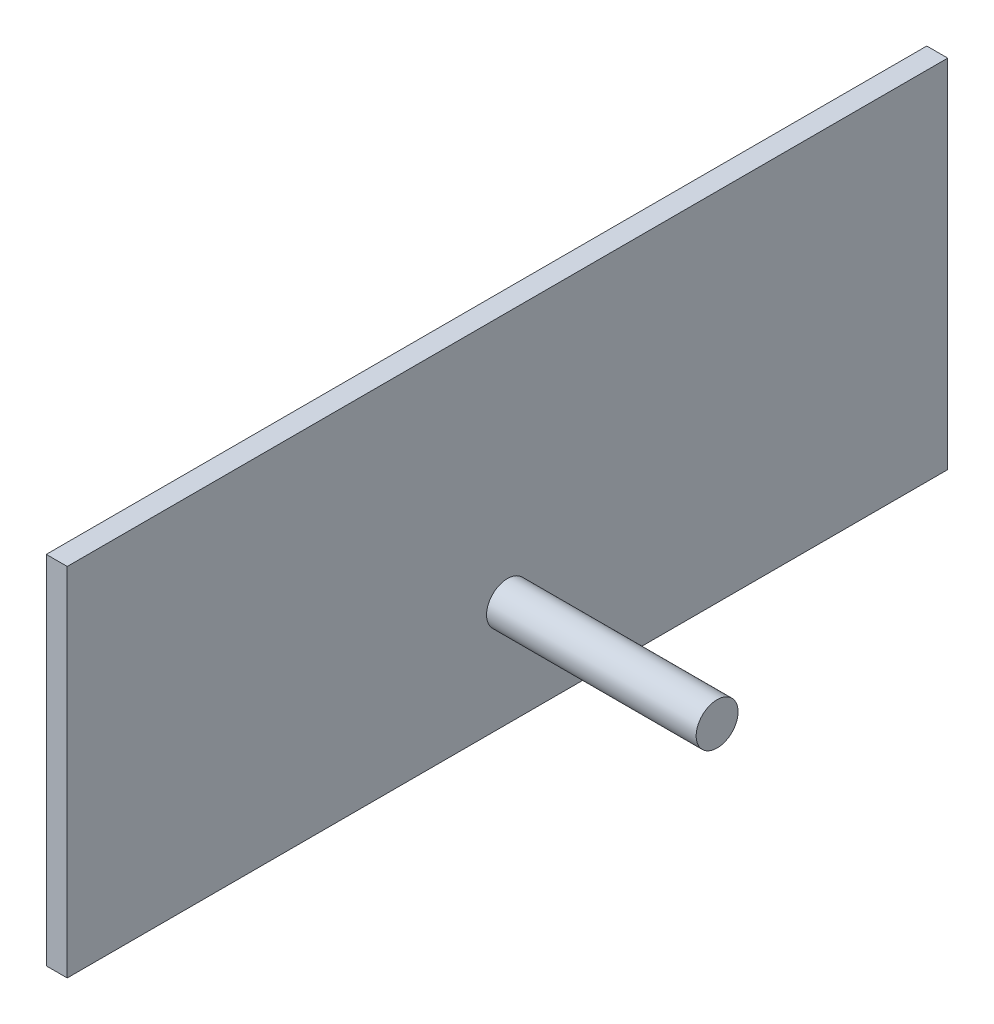
ISO-10303-21;
HEADER;
FILE_DESCRIPTION(('STEP AP214'),'2;1');
FILE_NAME('part.step','',(''),(''),'','','');
FILE_SCHEMA(('AUTOMOTIVE_DESIGN { 1 0 10303 214 1 1 1 1 }'));
ENDSEC;
DATA;
#1=APPLICATION_CONTEXT('core data for automotive mechanical design processes');
#2=APPLICATION_PROTOCOL_DEFINITION('international standard','automotive_design',2000,#1);
#3=PRODUCT_CONTEXT('',#1,'mechanical');
#4=PRODUCT('Part','Part','',(#3));
#5=PRODUCT_RELATED_PRODUCT_CATEGORY('part','',(#4));
#6=PRODUCT_DEFINITION_FORMATION('','',#4);
#7=PRODUCT_DEFINITION_CONTEXT('part definition',#1,'design');
#8=PRODUCT_DEFINITION('design','',#6,#7);
#9=PRODUCT_DEFINITION_SHAPE('','',#8);
#10=(LENGTH_UNIT() NAMED_UNIT(*) SI_UNIT(.MILLI.,.METRE.));
#11=(NAMED_UNIT(*) PLANE_ANGLE_UNIT() SI_UNIT($,.RADIAN.));
#12=(NAMED_UNIT(*) SI_UNIT($,.STERADIAN.) SOLID_ANGLE_UNIT());
#13=UNCERTAINTY_MEASURE_WITH_UNIT(LENGTH_MEASURE(1.E-05),#10,'distance_accuracy_value','');
#14=(GEOMETRIC_REPRESENTATION_CONTEXT(3) GLOBAL_UNCERTAINTY_ASSIGNED_CONTEXT((#13)) GLOBAL_UNIT_ASSIGNED_CONTEXT((#10,
#11,#12)) REPRESENTATION_CONTEXT('',''));
#15=CARTESIAN_POINT('',(0.,0.,0.));
#16=DIRECTION('',(0.,0.,1.));
#17=DIRECTION('',(1.,0.,0.));
#18=AXIS2_PLACEMENT_3D('',#15,#16,#17);
#19=CARTESIAN_POINT('',(-5.,-25.,0.));
#20=DIRECTION('',(0.,-1.,0.));
#21=DIRECTION('',(0.,0.,-1.));
#22=AXIS2_PLACEMENT_3D('',#19,#20,#21);
#23=PLANE('',#22);
#24=DIRECTION('',(0.,0.,-1.));
#25=VECTOR('',#24,1.);
#26=CARTESIAN_POINT('',(0.,-25.,0.));
#27=LINE('',#26,#25);
#28=CARTESIAN_POINT('',(0.,-25.,105.));
#29=VERTEX_POINT('',#28);
#30=CARTESIAN_POINT('',(0.,-25.,-105.));
#31=VERTEX_POINT('',#30);
#32=EDGE_CURVE('E77',#29,#31,#27,.T.);
#33=ORIENTED_EDGE('',*,*,#32,.F.);
#34=DIRECTION('',(1.,0.,0.));
#35=VECTOR('',#34,1.);
#36=CARTESIAN_POINT('',(-5.,-25.,105.));
#37=LINE('',#36,#35);
#38=CARTESIAN_POINT('',(-5.,-25.,105.));
#39=VERTEX_POINT('',#38);
#40=EDGE_CURVE('E54',#39,#29,#37,.T.);
#41=ORIENTED_EDGE('',*,*,#40,.F.);
#42=DIRECTION('',(0.,0.,-1.));
#43=VECTOR('',#42,1.);
#44=CARTESIAN_POINT('',(-5.,-25.,105.));
#45=LINE('',#44,#43);
#46=CARTESIAN_POINT('',(-5.,-25.,-105.));
#47=VERTEX_POINT('',#46);
#48=EDGE_CURVE('E62',#39,#47,#45,.T.);
#49=ORIENTED_EDGE('',*,*,#48,.T.);
#50=DIRECTION('',(1.,0.,0.));
#51=VECTOR('',#50,1.);
#52=CARTESIAN_POINT('',(-5.,-25.,-105.));
#53=LINE('',#52,#51);
#54=EDGE_CURVE('E12',#47,#31,#53,.T.);
#55=ORIENTED_EDGE('',*,*,#54,.T.);
#56=EDGE_LOOP('',(#33,#41,#49,#55));
#57=FACE_BOUND('',#56,.T.);
#58=ADVANCED_FACE('F44',(#57),#23,.T.);
#59=CARTESIAN_POINT('',(-5.,0.,105.));
#60=DIRECTION('',(0.,0.,1.));
#61=DIRECTION('',(1.,0.,0.));
#62=AXIS2_PLACEMENT_3D('',#59,#60,#61);
#63=PLANE('',#62);
#64=DIRECTION('',(0.,-1.,0.));
#65=VECTOR('',#64,1.);
#66=CARTESIAN_POINT('',(0.,0.,105.));
#67=LINE('',#66,#65);
#68=CARTESIAN_POINT('',(0.,60.,105.));
#69=VERTEX_POINT('',#68);
#70=EDGE_CURVE('E106',#69,#29,#67,.T.);
#71=ORIENTED_EDGE('',*,*,#70,.F.);
#72=DIRECTION('',(1.,0.,0.));
#73=VECTOR('',#72,1.);
#74=CARTESIAN_POINT('',(-5.,60.,105.));
#75=LINE('',#74,#73);
#76=CARTESIAN_POINT('',(-5.,60.,105.));
#77=VERTEX_POINT('',#76);
#78=EDGE_CURVE('E97',#77,#69,#75,.T.);
#79=ORIENTED_EDGE('',*,*,#78,.F.);
#80=DIRECTION('',(0.,-1.,0.));
#81=VECTOR('',#80,1.);
#82=CARTESIAN_POINT('',(-5.,0.,105.));
#83=LINE('',#82,#81);
#84=EDGE_CURVE('E101',#77,#39,#83,.T.);
#85=ORIENTED_EDGE('',*,*,#84,.T.);
#86=ORIENTED_EDGE('',*,*,#40,.T.);
#87=EDGE_LOOP('',(#71,#79,#85,#86));
#88=FACE_BOUND('',#87,.T.);
#89=ADVANCED_FACE('F104',(#88),#63,.T.);
#90=CARTESIAN_POINT('',(-5.,60.,105.));
#91=DIRECTION('',(0.,1.,0.));
#92=DIRECTION('',(0.,0.,1.));
#93=AXIS2_PLACEMENT_3D('',#90,#91,#92);
#94=PLANE('',#93);
#95=DIRECTION('',(0.,0.,1.));
#96=VECTOR('',#95,1.);
#97=CARTESIAN_POINT('',(0.,60.,105.));
#98=LINE('',#97,#96);
#99=CARTESIAN_POINT('',(0.,60.,-105.));
#100=VERTEX_POINT('',#99);
#101=EDGE_CURVE('E113',#100,#69,#98,.T.);
#102=ORIENTED_EDGE('',*,*,#101,.F.);
#103=DIRECTION('',(1.,0.,0.));
#104=VECTOR('',#103,1.);
#105=CARTESIAN_POINT('',(-5.,60.,-105.));
#106=LINE('',#105,#104);
#107=CARTESIAN_POINT('',(-5.,60.,-105.));
#108=VERTEX_POINT('',#107);
#109=EDGE_CURVE('E48',#108,#100,#106,.T.);
#110=ORIENTED_EDGE('',*,*,#109,.F.);
#111=DIRECTION('',(0.,0.,1.));
#112=VECTOR('',#111,1.);
#113=CARTESIAN_POINT('',(-5.,60.,0.));
#114=LINE('',#113,#112);
#115=EDGE_CURVE('E94',#108,#77,#114,.T.);
#116=ORIENTED_EDGE('',*,*,#115,.T.);
#117=ORIENTED_EDGE('',*,*,#78,.T.);
#118=EDGE_LOOP('',(#102,#110,#116,#117));
#119=FACE_BOUND('',#118,.T.);
#120=ADVANCED_FACE('F96',(#119),#94,.T.);
#121=CARTESIAN_POINT('',(-5.,60.,-105.));
#122=DIRECTION('',(0.,0.,-1.));
#123=DIRECTION('',(-1.,0.,0.));
#124=AXIS2_PLACEMENT_3D('',#121,#122,#123);
#125=PLANE('',#124);
#126=DIRECTION('',(0.,1.,0.));
#127=VECTOR('',#126,1.);
#128=CARTESIAN_POINT('',(0.,60.,-105.));
#129=LINE('',#128,#127);
#130=EDGE_CURVE('E84',#31,#100,#129,.T.);
#131=ORIENTED_EDGE('',*,*,#130,.F.);
#132=ORIENTED_EDGE('',*,*,#54,.F.);
#133=DIRECTION('',(0.,1.,0.));
#134=VECTOR('',#133,1.);
#135=CARTESIAN_POINT('',(-5.,-25.,-105.));
#136=LINE('',#135,#134);
#137=EDGE_CURVE('E88',#47,#108,#136,.T.);
#138=ORIENTED_EDGE('',*,*,#137,.T.);
#139=ORIENTED_EDGE('',*,*,#109,.T.);
#140=EDGE_LOOP('',(#131,#132,#138,#139));
#141=FACE_BOUND('',#140,.T.);
#142=ADVANCED_FACE('F46',(#141),#125,.T.);
#143=CARTESIAN_POINT('',(-5.,0.,0.));
#144=DIRECTION('',(-1.,0.,0.));
#145=DIRECTION('',(0.,0.,1.));
#146=AXIS2_PLACEMENT_3D('',#143,#144,#145);
#147=PLANE('',#146);
#148=CARTESIAN_POINT('',(-5.,0.,0.));
#149=DIRECTION('',(1.,0.,0.));
#150=DIRECTION('',(0.,0.,-1.));
#151=AXIS2_PLACEMENT_3D('',#148,#149,#150);
#152=CIRCLE('',#151,5.);
#153=CARTESIAN_POINT('',(-5.,0.,-5.));
#154=VERTEX_POINT('',#153);
#155=EDGE_CURVE('E114',#154,#154,#152,.T.);
#156=ORIENTED_EDGE('',*,*,#155,.T.);
#157=EDGE_LOOP('',(#156));
#158=FACE_BOUND('',#157,.T.);
#159=ORIENTED_EDGE('',*,*,#137,.F.);
#160=ORIENTED_EDGE('',*,*,#48,.F.);
#161=ORIENTED_EDGE('',*,*,#84,.F.);
#162=ORIENTED_EDGE('',*,*,#115,.F.);
#163=EDGE_LOOP('',(#159,#160,#161,#162));
#164=FACE_BOUND('',#163,.T.);
#165=ADVANCED_FACE('F107',(#158,#164),#147,.T.);
#166=CARTESIAN_POINT('',(0.,0.,0.));
#167=DIRECTION('',(-1.,0.,0.));
#168=DIRECTION('',(0.,0.,1.));
#169=AXIS2_PLACEMENT_3D('',#166,#167,#168);
#170=PLANE('',#169);
#171=CARTESIAN_POINT('',(0.,0.,0.));
#172=DIRECTION('',(1.,0.,0.));
#173=DIRECTION('',(0.,0.,-1.));
#174=AXIS2_PLACEMENT_3D('',#171,#172,#173);
#175=CIRCLE('',#174,5.);
#176=CARTESIAN_POINT('',(0.,0.,-5.));
#177=VERTEX_POINT('',#176);
#178=EDGE_CURVE('E147',#177,#177,#175,.T.);
#179=ORIENTED_EDGE('',*,*,#178,.F.);
#180=EDGE_LOOP('',(#179));
#181=FACE_BOUND('',#180,.T.);
#182=ORIENTED_EDGE('',*,*,#32,.T.);
#183=ORIENTED_EDGE('',*,*,#130,.T.);
#184=ORIENTED_EDGE('',*,*,#101,.T.);
#185=ORIENTED_EDGE('',*,*,#70,.T.);
#186=EDGE_LOOP('',(#182,#183,#184,#185));
#187=FACE_BOUND('',#186,.T.);
#188=ADVANCED_FACE('F119',(#181,#187),#170,.F.);
#189=CARTESIAN_POINT('',(-5.,0.,0.));
#190=DIRECTION('',(1.,0.,0.));
#191=DIRECTION('',(0.,0.,-1.));
#192=AXIS2_PLACEMENT_3D('',#189,#190,#191);
#193=CYLINDRICAL_SURFACE('',#192,5.);
#194=ORIENTED_EDGE('',*,*,#155,.F.);
#195=EDGE_LOOP('',(#194));
#196=FACE_BOUND('',#195,.T.);
#197=ORIENTED_EDGE('',*,*,#178,.T.);
#198=EDGE_LOOP('',(#197));
#199=FACE_BOUND('',#198,.T.);
#200=ADVANCED_FACE('F135',(#196,#199),#193,.F.);
#201=CLOSED_SHELL('',(#58,#89,#120,#142,#165,#188,#200));
#202=MANIFOLD_SOLID_BREP('B2',#201);
#203=CARTESIAN_POINT('',(-5.,0.,0.));
#204=DIRECTION('',(1.,0.,0.));
#205=DIRECTION('',(0.,0.,-1.));
#206=AXIS2_PLACEMENT_3D('',#203,#204,#205);
#207=CYLINDRICAL_SURFACE('',#206,5.);
#208=CARTESIAN_POINT('',(-5.,0.,0.));
#209=DIRECTION('',(1.,0.,0.));
#210=DIRECTION('',(0.,0.,-1.));
#211=AXIS2_PLACEMENT_3D('',#208,#209,#210);
#212=CIRCLE('',#211,5.);
#213=CARTESIAN_POINT('',(-5.,0.,-5.));
#214=VERTEX_POINT('',#213);
#215=EDGE_CURVE('E43',#214,#214,#212,.T.);
#216=ORIENTED_EDGE('',*,*,#215,.T.);
#217=EDGE_LOOP('',(#216));
#218=FACE_BOUND('',#217,.T.);
#219=CARTESIAN_POINT('',(50.,0.,0.));
#220=DIRECTION('',(1.,0.,0.));
#221=DIRECTION('',(0.,0.,-1.));
#222=AXIS2_PLACEMENT_3D('',#219,#220,#221);
#223=CIRCLE('',#222,5.);
#224=CARTESIAN_POINT('',(50.,0.,-5.));
#225=VERTEX_POINT('',#224);
#226=EDGE_CURVE('E206',#225,#225,#223,.T.);
#227=ORIENTED_EDGE('',*,*,#226,.F.);
#228=EDGE_LOOP('',(#227));
#229=FACE_BOUND('',#228,.T.);
#230=ADVANCED_FACE('F200',(#218,#229),#207,.T.);
#231=CARTESIAN_POINT('',(-5.,0.,0.));
#232=DIRECTION('',(1.,0.,0.));
#233=DIRECTION('',(0.,0.,-1.));
#234=AXIS2_PLACEMENT_3D('',#231,#232,#233);
#235=PLANE('',#234);
#236=ORIENTED_EDGE('',*,*,#215,.F.);
#237=EDGE_LOOP('',(#236));
#238=FACE_BOUND('',#237,.T.);
#239=ADVANCED_FACE('F215',(#238),#235,.F.);
#240=CARTESIAN_POINT('',(50.,0.,0.));
#241=DIRECTION('',(1.,0.,0.));
#242=DIRECTION('',(0.,0.,-1.));
#243=AXIS2_PLACEMENT_3D('',#240,#241,#242);
#244=PLANE('',#243);
#245=ORIENTED_EDGE('',*,*,#226,.T.);
#246=EDGE_LOOP('',(#245));
#247=FACE_BOUND('',#246,.T.);
#248=ADVANCED_FACE('F212',(#247),#244,.T.);
#249=CLOSED_SHELL('',(#230,#239,#248));
#250=MANIFOLD_SOLID_BREP('B6',#249);
#251=ADVANCED_BREP_SHAPE_REPRESENTATION('',(#18,#202,#250),#14);
#252=SHAPE_DEFINITION_REPRESENTATION(#9,#251);
ENDSEC;
END-ISO-10303-21;
